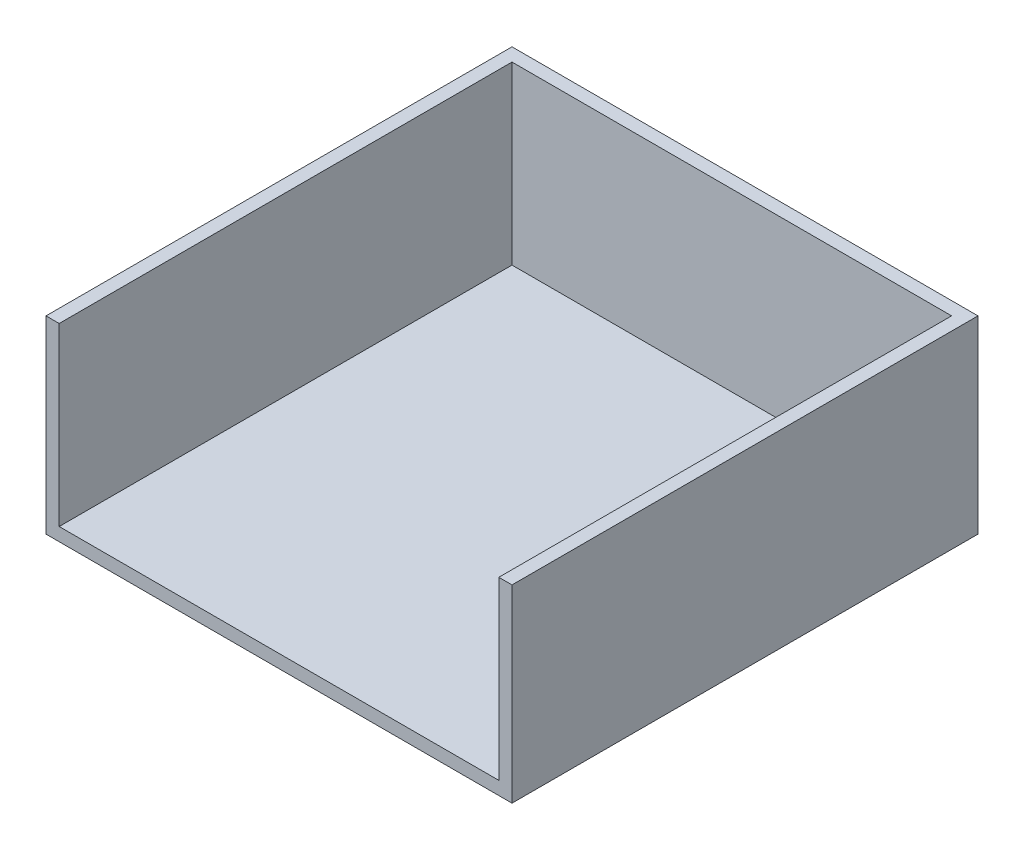
ISO-10303-21;
HEADER;
FILE_DESCRIPTION(('STEP AP214'),'2;1');
FILE_NAME('part.step','',(''),(''),'','','');
FILE_SCHEMA(('AUTOMOTIVE_DESIGN { 1 0 10303 214 1 1 1 1 }'));
ENDSEC;
DATA;
#1=APPLICATION_CONTEXT('core data for automotive mechanical design processes');
#2=APPLICATION_PROTOCOL_DEFINITION('international standard','automotive_design',2000,#1);
#3=PRODUCT_CONTEXT('',#1,'mechanical');
#4=PRODUCT('Part','Part','',(#3));
#5=PRODUCT_RELATED_PRODUCT_CATEGORY('part','',(#4));
#6=PRODUCT_DEFINITION_FORMATION('','',#4);
#7=PRODUCT_DEFINITION_CONTEXT('part definition',#1,'design');
#8=PRODUCT_DEFINITION('design','',#6,#7);
#9=PRODUCT_DEFINITION_SHAPE('','',#8);
#10=(LENGTH_UNIT() NAMED_UNIT(*) SI_UNIT(.MILLI.,.METRE.));
#11=(NAMED_UNIT(*) PLANE_ANGLE_UNIT() SI_UNIT($,.RADIAN.));
#12=(NAMED_UNIT(*) SI_UNIT($,.STERADIAN.) SOLID_ANGLE_UNIT());
#13=UNCERTAINTY_MEASURE_WITH_UNIT(LENGTH_MEASURE(1.E-05),#10,'distance_accuracy_value','');
#14=(GEOMETRIC_REPRESENTATION_CONTEXT(3) GLOBAL_UNCERTAINTY_ASSIGNED_CONTEXT((#13)) GLOBAL_UNIT_ASSIGNED_CONTEXT((#10,
#11,#12)) REPRESENTATION_CONTEXT('',''));
#15=CARTESIAN_POINT('',(0.,0.,0.));
#16=DIRECTION('',(0.,0.,1.));
#17=DIRECTION('',(1.,0.,0.));
#18=AXIS2_PLACEMENT_3D('',#15,#16,#17);
#19=CARTESIAN_POINT('',(0.,1.5,0.));
#20=DIRECTION('',(0.,-1.,0.));
#21=DIRECTION('',(0.,0.,-1.));
#22=AXIS2_PLACEMENT_3D('',#19,#20,#21);
#23=PLANE('',#22);
#24=DIRECTION('',(0.,0.,1.));
#25=VECTOR('',#24,1.);
#26=CARTESIAN_POINT('',(51.5,1.5,0.));
#27=LINE('',#26,#25);
#28=CARTESIAN_POINT('',(51.5,1.5,-51.5));
#29=VERTEX_POINT('',#28);
#30=CARTESIAN_POINT('',(51.5,1.5,0.));
#31=VERTEX_POINT('',#30);
#32=EDGE_CURVE('E48',#29,#31,#27,.T.);
#33=ORIENTED_EDGE('',*,*,#32,.F.);
#34=DIRECTION('',(1.,0.,0.));
#35=VECTOR('',#34,1.);
#36=CARTESIAN_POINT('',(51.5,1.5,-51.5));
#37=LINE('',#36,#35);
#38=CARTESIAN_POINT('',(1.5,1.5,-51.5));
#39=VERTEX_POINT('',#38);
#40=EDGE_CURVE('E165',#39,#29,#37,.T.);
#41=ORIENTED_EDGE('',*,*,#40,.F.);
#42=DIRECTION('',(0.,0.,-1.));
#43=VECTOR('',#42,1.);
#44=CARTESIAN_POINT('',(1.5,1.5,-51.5));
#45=LINE('',#44,#43);
#46=CARTESIAN_POINT('',(1.5,1.5,0.));
#47=VERTEX_POINT('',#46);
#48=EDGE_CURVE('E163',#47,#39,#45,.T.);
#49=ORIENTED_EDGE('',*,*,#48,.F.);
#50=DIRECTION('',(1.,0.,0.));
#51=VECTOR('',#50,1.);
#52=CARTESIAN_POINT('',(0.,1.5,0.));
#53=LINE('',#52,#51);
#54=EDGE_CURVE('E53',#47,#31,#53,.T.);
#55=ORIENTED_EDGE('',*,*,#54,.T.);
#56=EDGE_LOOP('',(#33,#41,#49,#55));
#57=FACE_BOUND('',#56,.T.);
#58=ADVANCED_FACE('F33',(#57),#23,.F.);
#59=CARTESIAN_POINT('',(0.,1.5,0.));
#60=DIRECTION('',(1.,0.,0.));
#61=DIRECTION('',(0.,0.,-1.));
#62=AXIS2_PLACEMENT_3D('',#59,#60,#61);
#63=PLANE('',#62);
#64=DIRECTION('',(0.,0.,1.));
#65=VECTOR('',#64,1.);
#66=CARTESIAN_POINT('',(0.,0.,0.));
#67=LINE('',#66,#65);
#68=CARTESIAN_POINT('',(0.,0.,-53.));
#69=VERTEX_POINT('',#68);
#70=CARTESIAN_POINT('',(0.,0.,0.));
#71=VERTEX_POINT('',#70);
#72=EDGE_CURVE('E119',#69,#71,#67,.T.);
#73=ORIENTED_EDGE('',*,*,#72,.T.);
#74=DIRECTION('',(0.,-1.,0.));
#75=VECTOR('',#74,1.);
#76=CARTESIAN_POINT('',(0.,1.5,0.));
#77=LINE('',#76,#75);
#78=CARTESIAN_POINT('',(0.,21.5,0.));
#79=VERTEX_POINT('',#78);
#80=EDGE_CURVE('E11',#79,#71,#77,.T.);
#81=ORIENTED_EDGE('',*,*,#80,.F.);
#82=DIRECTION('',(0.,0.,1.));
#83=VECTOR('',#82,1.);
#84=CARTESIAN_POINT('',(0.,21.5,0.));
#85=LINE('',#84,#83);
#86=CARTESIAN_POINT('',(0.,21.5,-53.));
#87=VERTEX_POINT('',#86);
#88=EDGE_CURVE('E114',#87,#79,#85,.T.);
#89=ORIENTED_EDGE('',*,*,#88,.F.);
#90=DIRECTION('',(0.,-1.,0.));
#91=VECTOR('',#90,1.);
#92=CARTESIAN_POINT('',(0.,1.5,-53.));
#93=LINE('',#92,#91);
#94=EDGE_CURVE('E128',#87,#69,#93,.T.);
#95=ORIENTED_EDGE('',*,*,#94,.T.);
#96=EDGE_LOOP('',(#73,#81,#89,#95));
#97=FACE_BOUND('',#96,.T.);
#98=ADVANCED_FACE('F35',(#97),#63,.F.);
#99=CARTESIAN_POINT('',(0.,1.5,0.));
#100=DIRECTION('',(0.,0.,-1.));
#101=DIRECTION('',(-1.,0.,0.));
#102=AXIS2_PLACEMENT_3D('',#99,#100,#101);
#103=PLANE('',#102);
#104=DIRECTION('',(1.,0.,0.));
#105=VECTOR('',#104,1.);
#106=CARTESIAN_POINT('',(0.,0.,0.));
#107=LINE('',#106,#105);
#108=CARTESIAN_POINT('',(53.,0.,0.));
#109=VERTEX_POINT('',#108);
#110=EDGE_CURVE('E122',#71,#109,#107,.T.);
#111=ORIENTED_EDGE('',*,*,#110,.T.);
#112=DIRECTION('',(0.,-1.,0.));
#113=VECTOR('',#112,1.);
#114=CARTESIAN_POINT('',(53.,1.5,0.));
#115=LINE('',#114,#113);
#116=CARTESIAN_POINT('',(53.,21.5,0.));
#117=VERTEX_POINT('',#116);
#118=EDGE_CURVE('E41',#117,#109,#115,.T.);
#119=ORIENTED_EDGE('',*,*,#118,.F.);
#120=DIRECTION('',(1.,0.,0.));
#121=VECTOR('',#120,1.);
#122=CARTESIAN_POINT('',(53.,21.5,0.));
#123=LINE('',#122,#121);
#124=CARTESIAN_POINT('',(51.5,21.5,0.));
#125=VERTEX_POINT('',#124);
#126=EDGE_CURVE('E270',#125,#117,#123,.T.);
#127=ORIENTED_EDGE('',*,*,#126,.F.);
#128=DIRECTION('',(0.,-1.,0.));
#129=VECTOR('',#128,1.);
#130=CARTESIAN_POINT('',(51.5,21.5,0.));
#131=LINE('',#130,#129);
#132=EDGE_CURVE('E156',#125,#31,#131,.T.);
#133=ORIENTED_EDGE('',*,*,#132,.T.);
#134=ORIENTED_EDGE('',*,*,#54,.F.);
#135=DIRECTION('',(0.,-1.,0.));
#136=VECTOR('',#135,1.);
#137=CARTESIAN_POINT('',(1.50000000000001,21.5,0.));
#138=LINE('',#137,#136);
#139=CARTESIAN_POINT('',(1.50000000000001,21.5,0.));
#140=VERTEX_POINT('',#139);
#141=EDGE_CURVE('E101',#140,#47,#138,.T.);
#142=ORIENTED_EDGE('',*,*,#141,.F.);
#143=DIRECTION('',(1.,0.,0.));
#144=VECTOR('',#143,1.);
#145=CARTESIAN_POINT('',(1.50000000000001,21.5,0.));
#146=LINE('',#145,#144);
#147=EDGE_CURVE('E107',#79,#140,#146,.T.);
#148=ORIENTED_EDGE('',*,*,#147,.F.);
#149=ORIENTED_EDGE('',*,*,#80,.T.);
#150=EDGE_LOOP('',(#111,#119,#127,#133,#134,#142,#148,#149));
#151=FACE_BOUND('',#150,.T.);
#152=ADVANCED_FACE('F117',(#151),#103,.F.);
#153=CARTESIAN_POINT('',(53.,1.5,0.));
#154=DIRECTION('',(-1.,0.,0.));
#155=DIRECTION('',(0.,0.,1.));
#156=AXIS2_PLACEMENT_3D('',#153,#154,#155);
#157=PLANE('',#156);
#158=DIRECTION('',(0.,0.,-1.));
#159=VECTOR('',#158,1.);
#160=CARTESIAN_POINT('',(53.,0.,0.));
#161=LINE('',#160,#159);
#162=CARTESIAN_POINT('',(53.,0.,-53.));
#163=VERTEX_POINT('',#162);
#164=EDGE_CURVE('E132',#109,#163,#161,.T.);
#165=ORIENTED_EDGE('',*,*,#164,.T.);
#166=DIRECTION('',(0.,-1.,0.));
#167=VECTOR('',#166,1.);
#168=CARTESIAN_POINT('',(53.,1.5,-53.));
#169=LINE('',#168,#167);
#170=CARTESIAN_POINT('',(53.,21.5,-53.));
#171=VERTEX_POINT('',#170);
#172=EDGE_CURVE('E137',#171,#163,#169,.T.);
#173=ORIENTED_EDGE('',*,*,#172,.F.);
#174=DIRECTION('',(0.,0.,-1.));
#175=VECTOR('',#174,1.);
#176=CARTESIAN_POINT('',(53.,21.5,-53.));
#177=LINE('',#176,#175);
#178=EDGE_CURVE('E145',#117,#171,#177,.T.);
#179=ORIENTED_EDGE('',*,*,#178,.F.);
#180=ORIENTED_EDGE('',*,*,#118,.T.);
#181=EDGE_LOOP('',(#165,#173,#179,#180));
#182=FACE_BOUND('',#181,.T.);
#183=ADVANCED_FACE('F143',(#182),#157,.F.);
#184=CARTESIAN_POINT('',(0.,1.5,-53.));
#185=DIRECTION('',(0.,0.,1.));
#186=DIRECTION('',(1.,0.,0.));
#187=AXIS2_PLACEMENT_3D('',#184,#185,#186);
#188=PLANE('',#187);
#189=DIRECTION('',(-1.,0.,0.));
#190=VECTOR('',#189,1.);
#191=CARTESIAN_POINT('',(0.,0.,-53.));
#192=LINE('',#191,#190);
#193=EDGE_CURVE('E129',#163,#69,#192,.T.);
#194=ORIENTED_EDGE('',*,*,#193,.T.);
#195=ORIENTED_EDGE('',*,*,#94,.F.);
#196=DIRECTION('',(-1.,0.,0.));
#197=VECTOR('',#196,1.);
#198=CARTESIAN_POINT('',(0.,21.5,-53.));
#199=LINE('',#198,#197);
#200=EDGE_CURVE('E157',#171,#87,#199,.T.);
#201=ORIENTED_EDGE('',*,*,#200,.F.);
#202=ORIENTED_EDGE('',*,*,#172,.T.);
#203=EDGE_LOOP('',(#194,#195,#201,#202));
#204=FACE_BOUND('',#203,.T.);
#205=ADVANCED_FACE('F153',(#204),#188,.F.);
#206=CARTESIAN_POINT('',(0.,0.,0.));
#207=DIRECTION('',(0.,-1.,0.));
#208=DIRECTION('',(0.,0.,-1.));
#209=AXIS2_PLACEMENT_3D('',#206,#207,#208);
#210=PLANE('',#209);
#211=ORIENTED_EDGE('',*,*,#72,.F.);
#212=ORIENTED_EDGE('',*,*,#193,.F.);
#213=ORIENTED_EDGE('',*,*,#164,.F.);
#214=ORIENTED_EDGE('',*,*,#110,.F.);
#215=EDGE_LOOP('',(#211,#212,#213,#214));
#216=FACE_BOUND('',#215,.T.);
#217=ADVANCED_FACE('F151',(#216),#210,.T.);
#218=CARTESIAN_POINT('',(1.5,21.5,-51.5));
#219=DIRECTION('',(-1.,0.,0.));
#220=DIRECTION('',(0.,0.,1.));
#221=AXIS2_PLACEMENT_3D('',#218,#219,#220);
#222=PLANE('',#221);
#223=ORIENTED_EDGE('',*,*,#48,.T.);
#224=DIRECTION('',(0.,-1.,0.));
#225=VECTOR('',#224,1.);
#226=CARTESIAN_POINT('',(1.5,21.5,-51.5));
#227=LINE('',#226,#225);
#228=CARTESIAN_POINT('',(1.5,21.5,-51.5));
#229=VERTEX_POINT('',#228);
#230=EDGE_CURVE('E103',#229,#39,#227,.T.);
#231=ORIENTED_EDGE('',*,*,#230,.F.);
#232=DIRECTION('',(0.,0.,-1.));
#233=VECTOR('',#232,1.);
#234=CARTESIAN_POINT('',(1.5,21.5,-51.5));
#235=LINE('',#234,#233);
#236=EDGE_CURVE('E96',#140,#229,#235,.T.);
#237=ORIENTED_EDGE('',*,*,#236,.F.);
#238=ORIENTED_EDGE('',*,*,#141,.T.);
#239=EDGE_LOOP('',(#223,#231,#237,#238));
#240=FACE_BOUND('',#239,.T.);
#241=ADVANCED_FACE('F99',(#240),#222,.F.);
#242=CARTESIAN_POINT('',(51.5,21.5,-51.5));
#243=DIRECTION('',(0.,0.,-1.));
#244=DIRECTION('',(-1.,0.,0.));
#245=AXIS2_PLACEMENT_3D('',#242,#243,#244);
#246=PLANE('',#245);
#247=ORIENTED_EDGE('',*,*,#40,.T.);
#248=DIRECTION('',(0.,-1.,0.));
#249=VECTOR('',#248,1.);
#250=CARTESIAN_POINT('',(51.5,21.5,-51.5));
#251=LINE('',#250,#249);
#252=CARTESIAN_POINT('',(51.5,21.5,-51.5));
#253=VERTEX_POINT('',#252);
#254=EDGE_CURVE('E124',#253,#29,#251,.T.);
#255=ORIENTED_EDGE('',*,*,#254,.F.);
#256=DIRECTION('',(1.,0.,0.));
#257=VECTOR('',#256,1.);
#258=CARTESIAN_POINT('',(51.5,21.5,-51.5));
#259=LINE('',#258,#257);
#260=EDGE_CURVE('E106',#229,#253,#259,.T.);
#261=ORIENTED_EDGE('',*,*,#260,.F.);
#262=ORIENTED_EDGE('',*,*,#230,.T.);
#263=EDGE_LOOP('',(#247,#255,#261,#262));
#264=FACE_BOUND('',#263,.T.);
#265=ADVANCED_FACE('F175',(#264),#246,.F.);
#266=CARTESIAN_POINT('',(51.5,21.5,0.));
#267=DIRECTION('',(1.,0.,0.));
#268=DIRECTION('',(0.,0.,-1.));
#269=AXIS2_PLACEMENT_3D('',#266,#267,#268);
#270=PLANE('',#269);
#271=ORIENTED_EDGE('',*,*,#32,.T.);
#272=ORIENTED_EDGE('',*,*,#132,.F.);
#273=DIRECTION('',(0.,0.,1.));
#274=VECTOR('',#273,1.);
#275=CARTESIAN_POINT('',(51.5,21.5,0.));
#276=LINE('',#275,#274);
#277=EDGE_CURVE('E173',#253,#125,#276,.T.);
#278=ORIENTED_EDGE('',*,*,#277,.F.);
#279=ORIENTED_EDGE('',*,*,#254,.T.);
#280=EDGE_LOOP('',(#271,#272,#278,#279));
#281=FACE_BOUND('',#280,.T.);
#282=ADVANCED_FACE('F171',(#281),#270,.F.);
#283=CARTESIAN_POINT('',(0.,21.5,0.));
#284=DIRECTION('',(0.,-1.,0.));
#285=DIRECTION('',(0.,0.,-1.));
#286=AXIS2_PLACEMENT_3D('',#283,#284,#285);
#287=PLANE('',#286);
#288=ORIENTED_EDGE('',*,*,#147,.T.);
#289=ORIENTED_EDGE('',*,*,#236,.T.);
#290=ORIENTED_EDGE('',*,*,#260,.T.);
#291=ORIENTED_EDGE('',*,*,#277,.T.);
#292=ORIENTED_EDGE('',*,*,#126,.T.);
#293=ORIENTED_EDGE('',*,*,#178,.T.);
#294=ORIENTED_EDGE('',*,*,#200,.T.);
#295=ORIENTED_EDGE('',*,*,#88,.T.);
#296=EDGE_LOOP('',(#288,#289,#290,#291,#292,#293,#294,#295));
#297=FACE_BOUND('',#296,.T.);
#298=ADVANCED_FACE('F111',(#297),#287,.F.);
#299=CLOSED_SHELL('',(#58,#98,#152,#183,#205,#217,#241,#265,#282,#298));
#300=MANIFOLD_SOLID_BREP('B2',#299);
#301=ADVANCED_BREP_SHAPE_REPRESENTATION('',(#18,#300),#14);
#302=SHAPE_DEFINITION_REPRESENTATION(#9,#301);
ENDSEC;
END-ISO-10303-21;
